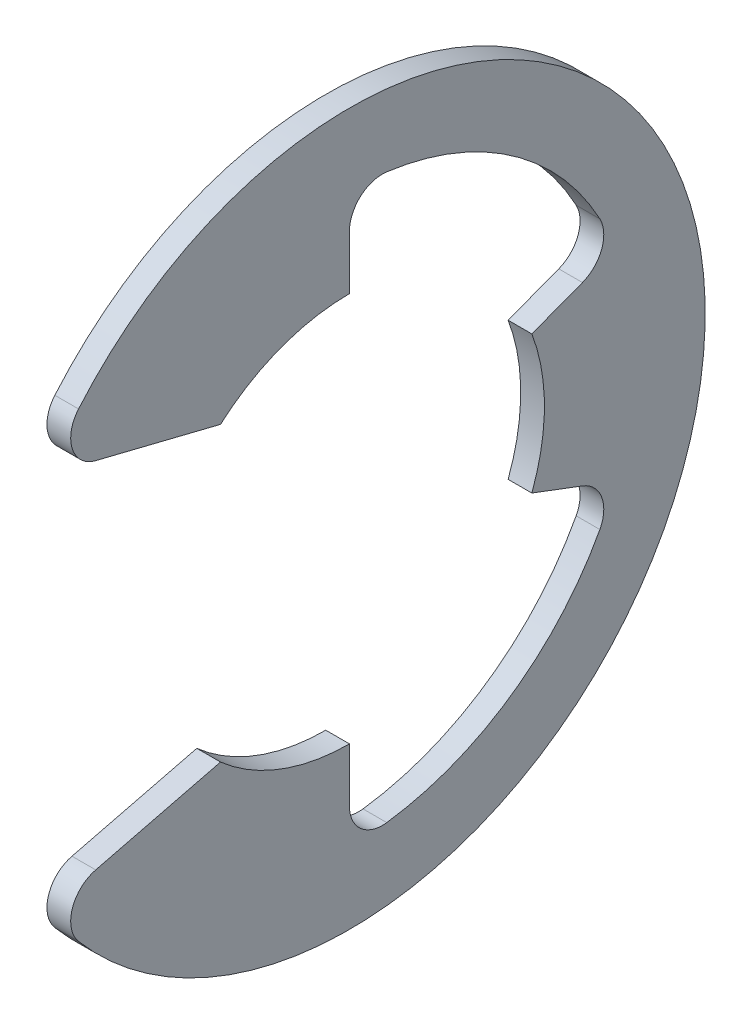
ISO-10303-21;
HEADER;
FILE_DESCRIPTION(('STEP AP214'),'2;1');
FILE_NAME('part.step','',(''),(''),'','','');
FILE_SCHEMA(('AUTOMOTIVE_DESIGN { 1 0 10303 214 1 1 1 1 }'));
ENDSEC;
DATA;
#1=APPLICATION_CONTEXT('core data for automotive mechanical design processes');
#2=APPLICATION_PROTOCOL_DEFINITION('international standard','automotive_design',2000,#1);
#3=PRODUCT_CONTEXT('',#1,'mechanical');
#4=PRODUCT('Part','Part','',(#3));
#5=PRODUCT_RELATED_PRODUCT_CATEGORY('part','',(#4));
#6=PRODUCT_DEFINITION_FORMATION('','',#4);
#7=PRODUCT_DEFINITION_CONTEXT('part definition',#1,'design');
#8=PRODUCT_DEFINITION('design','',#6,#7);
#9=PRODUCT_DEFINITION_SHAPE('','',#8);
#10=(LENGTH_UNIT() NAMED_UNIT(*) SI_UNIT(.MILLI.,.METRE.));
#11=(NAMED_UNIT(*) PLANE_ANGLE_UNIT() SI_UNIT($,.RADIAN.));
#12=(NAMED_UNIT(*) SI_UNIT($,.STERADIAN.) SOLID_ANGLE_UNIT());
#13=UNCERTAINTY_MEASURE_WITH_UNIT(LENGTH_MEASURE(1.E-05),#10,'distance_accuracy_value','');
#14=(GEOMETRIC_REPRESENTATION_CONTEXT(3) GLOBAL_UNCERTAINTY_ASSIGNED_CONTEXT((#13)) GLOBAL_UNIT_ASSIGNED_CONTEXT((#10,
#11,#12)) REPRESENTATION_CONTEXT('',''));
#15=CARTESIAN_POINT('',(0.,0.,0.));
#16=DIRECTION('',(0.,0.,1.));
#17=DIRECTION('',(1.,0.,0.));
#18=AXIS2_PLACEMENT_3D('',#15,#16,#17);
#19=CARTESIAN_POINT('',(-0.635,0.,0.));
#20=DIRECTION('',(-1.,0.,0.));
#21=DIRECTION('',(0.,0.,1.));
#22=AXIS2_PLACEMENT_3D('',#19,#20,#21);
#23=PLANE('',#22);
#24=DIRECTION('',(0.,1.,0.));
#25=VECTOR('',#24,1.);
#26=CARTESIAN_POINT('',(-0.635,10.4394,0.));
#27=LINE('',#26,#25);
#28=CARTESIAN_POINT('',(-0.635,10.4394,0.));
#29=VERTEX_POINT('',#28);
#30=CARTESIAN_POINT('',(-0.635,13.338729166687,0.));
#31=VERTEX_POINT('',#30);
#32=EDGE_CURVE('E175',#29,#31,#27,.T.);
#33=ORIENTED_EDGE('',*,*,#32,.F.);
#34=CARTESIAN_POINT('',(-0.635,0.,0.));
#35=DIRECTION('',(-1.,0.,0.));
#36=DIRECTION('',(0.,0.,1.));
#37=AXIS2_PLACEMENT_3D('',#34,#35,#36);
#38=CIRCLE('',#37,10.4394);
#39=CARTESIAN_POINT('',(-0.635,7.82955,6.90501405918192));
#40=VERTEX_POINT('',#39);
#41=EDGE_CURVE('E241',#29,#40,#38,.F.);
#42=ORIENTED_EDGE('',*,*,#41,.T.);
#43=DIRECTION('',(0.,-0.240952820606872,-0.970536829925373));
#44=VECTOR('',#43,1.);
#45=CARTESIAN_POINT('',(-0.635,10.1219114733049,16.1384450343451));
#46=LINE('',#45,#44);
#47=CARTESIAN_POINT('',(-0.635,9.48887934560397,13.5886471406645));
#48=VERTEX_POINT('',#47);
#49=EDGE_CURVE('E179',#48,#40,#46,.T.);
#50=ORIENTED_EDGE('',*,*,#49,.F.);
#51=CARTESIAN_POINT('',(-0.635,11.2021680114712,13.1632931264471));
#52=DIRECTION('',(-1.,0.,0.));
#53=DIRECTION('',(0.,0.,1.));
#54=AXIS2_PLACEMENT_3D('',#51,#52,#53);
#55=CIRCLE('',#54,1.7653);
#56=CARTESIAN_POINT('',(-0.635,12.3462542374775,14.5076706022562));
#57=VERTEX_POINT('',#56);
#58=EDGE_CURVE('E183',#57,#48,#55,.F.);
#59=ORIENTED_EDGE('',*,*,#58,.F.);
#60=CARTESIAN_POINT('',(-0.635,0.,0.));
#61=DIRECTION('',(-1.,0.,0.));
#62=DIRECTION('',(0.,0.,1.));
#63=AXIS2_PLACEMENT_3D('',#60,#61,#62);
#64=CIRCLE('',#63,19.05);
#65=CARTESIAN_POINT('',(-0.635,-12.3462542374775,14.5076706022562));
#66=VERTEX_POINT('',#65);
#67=EDGE_CURVE('E247',#66,#57,#64,.F.);
#68=ORIENTED_EDGE('',*,*,#67,.F.);
#69=CARTESIAN_POINT('',(-0.635,-11.2021680114712,13.1632931264471));
#70=DIRECTION('',(-1.,0.,0.));
#71=DIRECTION('',(0.,0.,1.));
#72=AXIS2_PLACEMENT_3D('',#69,#70,#71);
#73=CIRCLE('',#72,1.7653);
#74=CARTESIAN_POINT('',(-0.635,-9.48887934560397,13.5886471406645));
#75=VERTEX_POINT('',#74);
#76=EDGE_CURVE('E250',#75,#66,#73,.F.);
#77=ORIENTED_EDGE('',*,*,#76,.F.);
#78=DIRECTION('',(0.,-0.240952820606873,0.970536829925373));
#79=VECTOR('',#78,1.);
#80=CARTESIAN_POINT('',(-0.635,-10.1219114733049,16.1384450343451));
#81=LINE('',#80,#79);
#82=CARTESIAN_POINT('',(-0.635,-7.82955,6.90501405918192));
#83=VERTEX_POINT('',#82);
#84=EDGE_CURVE('E146',#83,#75,#81,.T.);
#85=ORIENTED_EDGE('',*,*,#84,.F.);
#86=CARTESIAN_POINT('',(-0.635,0.,0.));
#87=DIRECTION('',(-1.,0.,0.));
#88=DIRECTION('',(0.,0.,1.));
#89=AXIS2_PLACEMENT_3D('',#86,#87,#88);
#90=CIRCLE('',#89,10.4394);
#91=CARTESIAN_POINT('',(-0.635,-10.4394,0.));
#92=VERTEX_POINT('',#91);
#93=EDGE_CURVE('E20',#83,#92,#90,.F.);
#94=ORIENTED_EDGE('',*,*,#93,.T.);
#95=DIRECTION('',(0.,1.,0.));
#96=VECTOR('',#95,1.);
#97=CARTESIAN_POINT('',(-0.635,-10.4394,0.));
#98=LINE('',#97,#96);
#99=CARTESIAN_POINT('',(-0.635,-13.338729166687,0.));
#100=VERTEX_POINT('',#99);
#101=EDGE_CURVE('E143',#100,#92,#98,.T.);
#102=ORIENTED_EDGE('',*,*,#101,.F.);
#103=CARTESIAN_POINT('',(-0.635,-13.338729166687,-1.7653));
#104=DIRECTION('',(-1.,0.,0.));
#105=DIRECTION('',(0.,0.,1.));
#106=AXIS2_PLACEMENT_3D('',#103,#104,#105);
#107=CIRCLE('',#106,1.7653);
#108=CARTESIAN_POINT('',(-0.635,-15.0887697835385,-1.99690727400055));
#109=VERTEX_POINT('',#108);
#110=EDGE_CURVE('E220',#100,#109,#107,.F.);
#111=ORIENTED_EDGE('',*,*,#110,.T.);
#112=CARTESIAN_POINT('',(-0.635,0.,0.));
#113=DIRECTION('',(-1.,0.,0.));
#114=DIRECTION('',(0.,0.,1.));
#115=AXIS2_PLACEMENT_3D('',#112,#113,#114);
#116=CIRCLE('',#115,15.220335483871);
#117=CARTESIAN_POINT('',(-0.635,-7.20262142996807,-13.4082383920538));
#118=VERTEX_POINT('',#117);
#119=EDGE_CURVE('E222',#109,#118,#116,.F.);
#120=ORIENTED_EDGE('',*,*,#119,.T.);
#121=CARTESIAN_POINT('',(-0.635,-6.3672398693056,-11.8531108287636));
#122=DIRECTION('',(-1.,0.,0.));
#123=DIRECTION('',(0.,0.,1.));
#124=AXIS2_PLACEMENT_3D('',#121,#122,#123);
#125=CIRCLE('',#124,1.7653);
#126=CARTESIAN_POINT('',(-0.635,-4.71595292308758,-12.4772386291779));
#127=VERTEX_POINT('',#126);
#128=EDGE_CURVE('E225',#118,#127,#125,.F.);
#129=ORIENTED_EDGE('',*,*,#128,.T.);
#130=DIRECTION('',(0.,-0.353553390593274,-0.935414346693485));
#131=VECTOR('',#130,1.);
#132=CARTESIAN_POINT('',(-0.635,-3.69088526575942,-9.76516453087197));
#133=LINE('',#132,#131);
#134=CARTESIAN_POINT('',(-0.635,-3.69088526575942,-9.76516453087197));
#135=VERTEX_POINT('',#134);
#136=EDGE_CURVE('E166',#135,#127,#133,.T.);
#137=ORIENTED_EDGE('',*,*,#136,.F.);
#138=CARTESIAN_POINT('',(-0.635,0.,0.));
#139=DIRECTION('',(-1.,0.,0.));
#140=DIRECTION('',(0.,0.,1.));
#141=AXIS2_PLACEMENT_3D('',#138,#139,#140);
#142=CIRCLE('',#141,10.4394);
#143=CARTESIAN_POINT('',(-0.635,3.69088526575942,-9.76516453087196));
#144=VERTEX_POINT('',#143);
#145=EDGE_CURVE('E228',#135,#144,#142,.F.);
#146=ORIENTED_EDGE('',*,*,#145,.T.);
#147=DIRECTION('',(0.,-0.353553390593274,0.935414346693485));
#148=VECTOR('',#147,1.);
#149=CARTESIAN_POINT('',(-0.635,3.69088526575942,-9.76516453087197));
#150=LINE('',#149,#148);
#151=CARTESIAN_POINT('',(-0.635,4.71595292308759,-12.4772386291779));
#152=VERTEX_POINT('',#151);
#153=EDGE_CURVE('E170',#152,#144,#150,.T.);
#154=ORIENTED_EDGE('',*,*,#153,.F.);
#155=CARTESIAN_POINT('',(-0.635,6.3672398693056,-11.8531108287636));
#156=DIRECTION('',(-1.,0.,0.));
#157=DIRECTION('',(0.,0.,1.));
#158=AXIS2_PLACEMENT_3D('',#155,#156,#157);
#159=CIRCLE('',#158,1.7653);
#160=CARTESIAN_POINT('',(-0.635,7.20262142996808,-13.4082383920538));
#161=VERTEX_POINT('',#160);
#162=EDGE_CURVE('E174',#152,#161,#159,.F.);
#163=ORIENTED_EDGE('',*,*,#162,.T.);
#164=CARTESIAN_POINT('',(-0.635,0.,0.));
#165=DIRECTION('',(-1.,0.,0.));
#166=DIRECTION('',(0.,0.,1.));
#167=AXIS2_PLACEMENT_3D('',#164,#165,#166);
#168=CIRCLE('',#167,15.220335483871);
#169=CARTESIAN_POINT('',(-0.635,15.0887697835385,-1.99690727400054));
#170=VERTEX_POINT('',#169);
#171=EDGE_CURVE('E234',#161,#170,#168,.F.);
#172=ORIENTED_EDGE('',*,*,#171,.T.);
#173=CARTESIAN_POINT('',(-0.635,13.338729166687,-1.7653));
#174=DIRECTION('',(-1.,0.,0.));
#175=DIRECTION('',(0.,0.,1.));
#176=AXIS2_PLACEMENT_3D('',#173,#174,#175);
#177=CIRCLE('',#176,1.7653);
#178=EDGE_CURVE('E238',#170,#31,#177,.F.);
#179=ORIENTED_EDGE('',*,*,#178,.T.);
#180=EDGE_LOOP('',(#33,#42,#50,#59,#68,#77,#85,#94,#102,#111,#120,#129,#137,#146,#154,#163,#172,#179));
#181=FACE_BOUND('',#180,.T.);
#182=ADVANCED_FACE('F17',(#181),#23,.T.);
#183=CARTESIAN_POINT('',(0.635,-10.4394,0.));
#184=DIRECTION('',(0.,0.,-1.));
#185=DIRECTION('',(-1.,0.,0.));
#186=AXIS2_PLACEMENT_3D('',#183,#184,#185);
#187=PLANE('',#186);
#188=DIRECTION('',(0.,1.,0.));
#189=VECTOR('',#188,1.);
#190=CARTESIAN_POINT('',(0.635,0.,0.));
#191=LINE('',#190,#189);
#192=CARTESIAN_POINT('',(0.635,-13.338729166687,0.));
#193=VERTEX_POINT('',#192);
#194=CARTESIAN_POINT('',(0.635,-10.4394,0.));
#195=VERTEX_POINT('',#194);
#196=EDGE_CURVE('E219',#193,#195,#191,.T.);
#197=ORIENTED_EDGE('',*,*,#196,.F.);
#198=DIRECTION('',(-1.,0.,0.));
#199=VECTOR('',#198,1.);
#200=CARTESIAN_POINT('',(0.635,-13.338729166687,0.));
#201=LINE('',#200,#199);
#202=EDGE_CURVE('E154',#193,#100,#201,.T.);
#203=ORIENTED_EDGE('',*,*,#202,.T.);
#204=ORIENTED_EDGE('',*,*,#101,.T.);
#205=DIRECTION('',(-1.,0.,0.));
#206=VECTOR('',#205,1.);
#207=CARTESIAN_POINT('',(0.635,-10.4394,0.));
#208=LINE('',#207,#206);
#209=EDGE_CURVE('E148',#92,#195,#208,.F.);
#210=ORIENTED_EDGE('',*,*,#209,.T.);
#211=EDGE_LOOP('',(#197,#203,#204,#210));
#212=FACE_BOUND('',#211,.T.);
#213=ADVANCED_FACE('F151',(#212),#187,.T.);
#214=CARTESIAN_POINT('',(0.635,0.,0.));
#215=DIRECTION('',(-1.,0.,0.));
#216=DIRECTION('',(0.,0.,1.));
#217=AXIS2_PLACEMENT_3D('',#214,#215,#216);
#218=CYLINDRICAL_SURFACE('',#217,10.4394);
#219=ORIENTED_EDGE('',*,*,#209,.F.);
#220=ORIENTED_EDGE('',*,*,#93,.F.);
#221=DIRECTION('',(1.,0.,0.));
#222=VECTOR('',#221,1.);
#223=CARTESIAN_POINT('',(0.635,-7.82955,6.90501405918192));
#224=LINE('',#223,#222);
#225=CARTESIAN_POINT('',(0.635,-7.82955,6.90501405918191));
#226=VERTEX_POINT('',#225);
#227=EDGE_CURVE('E161',#226,#83,#224,.F.);
#228=ORIENTED_EDGE('',*,*,#227,.F.);
#229=CARTESIAN_POINT('',(0.635,0.,0.));
#230=DIRECTION('',(-1.,0.,0.));
#231=DIRECTION('',(0.,0.,1.));
#232=AXIS2_PLACEMENT_3D('',#229,#230,#231);
#233=CIRCLE('',#232,10.4394);
#234=EDGE_CURVE('E159',#195,#226,#233,.T.);
#235=ORIENTED_EDGE('',*,*,#234,.F.);
#236=EDGE_LOOP('',(#219,#220,#228,#235));
#237=FACE_BOUND('',#236,.T.);
#238=ADVANCED_FACE('F157',(#237),#218,.F.);
#239=CARTESIAN_POINT('',(0.635,-10.1219114733049,16.1384450343451));
#240=DIRECTION('',(0.,0.970536829925373,0.240952820606873));
#241=DIRECTION('',(0.,-0.240952820606873,0.970536829925373));
#242=AXIS2_PLACEMENT_3D('',#239,#240,#241);
#243=PLANE('',#242);
#244=ORIENTED_EDGE('',*,*,#84,.T.);
#245=DIRECTION('',(-1.,0.,0.));
#246=VECTOR('',#245,1.);
#247=CARTESIAN_POINT('',(0.635,-9.48887934560397,13.5886471406645));
#248=LINE('',#247,#246);
#249=CARTESIAN_POINT('',(0.635,-9.48887934560397,13.5886471406645));
#250=VERTEX_POINT('',#249);
#251=EDGE_CURVE('E184',#250,#75,#248,.T.);
#252=ORIENTED_EDGE('',*,*,#251,.F.);
#253=DIRECTION('',(0.,-0.240952820606872,0.970536829925373));
#254=VECTOR('',#253,1.);
#255=CARTESIAN_POINT('',(0.635,-7.82955,6.90501405918191));
#256=LINE('',#255,#254);
#257=EDGE_CURVE('E217',#226,#250,#256,.T.);
#258=ORIENTED_EDGE('',*,*,#257,.F.);
#259=ORIENTED_EDGE('',*,*,#227,.T.);
#260=EDGE_LOOP('',(#244,#252,#258,#259));
#261=FACE_BOUND('',#260,.T.);
#262=ADVANCED_FACE('F343',(#261),#243,.T.);
#263=CARTESIAN_POINT('',(0.635,-11.2021680114712,13.1632931264471));
#264=DIRECTION('',(-1.,0.,0.));
#265=DIRECTION('',(0.,0.,1.));
#266=AXIS2_PLACEMENT_3D('',#263,#264,#265);
#267=CYLINDRICAL_SURFACE('',#266,1.7653);
#268=ORIENTED_EDGE('',*,*,#76,.T.);
#269=DIRECTION('',(-1.,0.,0.));
#270=VECTOR('',#269,1.);
#271=CARTESIAN_POINT('',(0.635,-12.3462542374775,14.5076706022562));
#272=LINE('',#271,#270);
#273=CARTESIAN_POINT('',(0.635,-12.3462542374775,14.5076706022562));
#274=VERTEX_POINT('',#273);
#275=EDGE_CURVE('E249',#274,#66,#272,.T.);
#276=ORIENTED_EDGE('',*,*,#275,.F.);
#277=CARTESIAN_POINT('',(0.635,-11.2021680114712,13.1632931264471));
#278=DIRECTION('',(-1.,0.,0.));
#279=DIRECTION('',(0.,0.,1.));
#280=AXIS2_PLACEMENT_3D('',#277,#278,#279);
#281=CIRCLE('',#280,1.7653);
#282=EDGE_CURVE('E215',#250,#274,#281,.F.);
#283=ORIENTED_EDGE('',*,*,#282,.F.);
#284=ORIENTED_EDGE('',*,*,#251,.T.);
#285=EDGE_LOOP('',(#268,#276,#283,#284));
#286=FACE_BOUND('',#285,.T.);
#287=ADVANCED_FACE('F340',(#286),#267,.T.);
#288=CARTESIAN_POINT('',(0.635,0.,0.));
#289=DIRECTION('',(-1.,0.,0.));
#290=DIRECTION('',(0.,0.,1.));
#291=AXIS2_PLACEMENT_3D('',#288,#289,#290);
#292=CYLINDRICAL_SURFACE('',#291,19.05);
#293=CARTESIAN_POINT('',(0.635,0.,0.));
#294=DIRECTION('',(-1.,0.,0.));
#295=DIRECTION('',(0.,0.,1.));
#296=AXIS2_PLACEMENT_3D('',#293,#294,#295);
#297=CIRCLE('',#296,19.05);
#298=CARTESIAN_POINT('',(0.635,12.3462542374775,14.5076706022562));
#299=VERTEX_POINT('',#298);
#300=EDGE_CURVE('E212',#274,#299,#297,.F.);
#301=ORIENTED_EDGE('',*,*,#300,.F.);
#302=ORIENTED_EDGE('',*,*,#275,.T.);
#303=ORIENTED_EDGE('',*,*,#67,.T.);
#304=DIRECTION('',(-1.,0.,0.));
#305=VECTOR('',#304,1.);
#306=CARTESIAN_POINT('',(0.635,12.3462542374775,14.5076706022562));
#307=LINE('',#306,#305);
#308=EDGE_CURVE('E246',#299,#57,#307,.T.);
#309=ORIENTED_EDGE('',*,*,#308,.F.);
#310=EDGE_LOOP('',(#301,#302,#303,#309));
#311=FACE_BOUND('',#310,.T.);
#312=ADVANCED_FACE('F339',(#311),#292,.T.);
#313=CARTESIAN_POINT('',(0.635,11.2021680114712,13.1632931264471));
#314=DIRECTION('',(-1.,0.,0.));
#315=DIRECTION('',(0.,0.,1.));
#316=AXIS2_PLACEMENT_3D('',#313,#314,#315);
#317=CYLINDRICAL_SURFACE('',#316,1.7653);
#318=ORIENTED_EDGE('',*,*,#58,.T.);
#319=DIRECTION('',(1.,0.,0.));
#320=VECTOR('',#319,1.);
#321=CARTESIAN_POINT('',(0.635,9.48887934560397,13.5886471406645));
#322=LINE('',#321,#320);
#323=CARTESIAN_POINT('',(0.635,9.48887934560397,13.5886471406645));
#324=VERTEX_POINT('',#323);
#325=EDGE_CURVE('E182',#324,#48,#322,.F.);
#326=ORIENTED_EDGE('',*,*,#325,.F.);
#327=CARTESIAN_POINT('',(0.635,11.2021680114712,13.1632931264471));
#328=DIRECTION('',(-1.,0.,0.));
#329=DIRECTION('',(0.,0.,1.));
#330=AXIS2_PLACEMENT_3D('',#327,#328,#329);
#331=CIRCLE('',#330,1.7653);
#332=EDGE_CURVE('E210',#299,#324,#331,.F.);
#333=ORIENTED_EDGE('',*,*,#332,.F.);
#334=ORIENTED_EDGE('',*,*,#308,.T.);
#335=EDGE_LOOP('',(#318,#326,#333,#334));
#336=FACE_BOUND('',#335,.T.);
#337=ADVANCED_FACE('F337',(#336),#317,.T.);
#338=CARTESIAN_POINT('',(0.635,10.1219114733049,16.1384450343451));
#339=DIRECTION('',(0.,-0.970536829925373,0.240952820606872));
#340=DIRECTION('',(0.,-0.240952820606872,-0.970536829925373));
#341=AXIS2_PLACEMENT_3D('',#338,#339,#340);
#342=PLANE('',#341);
#343=DIRECTION('',(0.,-0.240952820606872,-0.970536829925373));
#344=VECTOR('',#343,1.);
#345=CARTESIAN_POINT('',(0.635,9.48887934560397,13.5886471406645));
#346=LINE('',#345,#344);
#347=CARTESIAN_POINT('',(0.635,7.82955,6.90501405918192));
#348=VERTEX_POINT('',#347);
#349=EDGE_CURVE('E209',#324,#348,#346,.T.);
#350=ORIENTED_EDGE('',*,*,#349,.F.);
#351=ORIENTED_EDGE('',*,*,#325,.T.);
#352=ORIENTED_EDGE('',*,*,#49,.T.);
#353=DIRECTION('',(-1.,0.,0.));
#354=VECTOR('',#353,1.);
#355=CARTESIAN_POINT('',(0.635,7.82955,6.90501405918192));
#356=LINE('',#355,#354);
#357=EDGE_CURVE('E243',#40,#348,#356,.F.);
#358=ORIENTED_EDGE('',*,*,#357,.T.);
#359=EDGE_LOOP('',(#350,#351,#352,#358));
#360=FACE_BOUND('',#359,.T.);
#361=ADVANCED_FACE('F330',(#360),#342,.T.);
#362=CARTESIAN_POINT('',(0.635,0.,0.));
#363=DIRECTION('',(-1.,0.,0.));
#364=DIRECTION('',(0.,0.,1.));
#365=AXIS2_PLACEMENT_3D('',#362,#363,#364);
#366=CYLINDRICAL_SURFACE('',#365,10.4394);
#367=ORIENTED_EDGE('',*,*,#357,.F.);
#368=ORIENTED_EDGE('',*,*,#41,.F.);
#369=DIRECTION('',(-1.,0.,0.));
#370=VECTOR('',#369,1.);
#371=CARTESIAN_POINT('',(0.635,10.4394,0.));
#372=LINE('',#371,#370);
#373=CARTESIAN_POINT('',(0.635,10.4394,0.));
#374=VERTEX_POINT('',#373);
#375=EDGE_CURVE('E178',#374,#29,#372,.T.);
#376=ORIENTED_EDGE('',*,*,#375,.F.);
#377=CARTESIAN_POINT('',(0.635,0.,0.));
#378=DIRECTION('',(-1.,0.,0.));
#379=DIRECTION('',(0.,0.,1.));
#380=AXIS2_PLACEMENT_3D('',#377,#378,#379);
#381=CIRCLE('',#380,10.4394);
#382=EDGE_CURVE('E206',#348,#374,#381,.T.);
#383=ORIENTED_EDGE('',*,*,#382,.F.);
#384=EDGE_LOOP('',(#367,#368,#376,#383));
#385=FACE_BOUND('',#384,.T.);
#386=ADVANCED_FACE('F333',(#385),#366,.F.);
#387=CARTESIAN_POINT('',(0.635,10.4394,0.));
#388=DIRECTION('',(0.,0.,-1.));
#389=DIRECTION('',(-1.,0.,0.));
#390=AXIS2_PLACEMENT_3D('',#387,#388,#389);
#391=PLANE('',#390);
#392=ORIENTED_EDGE('',*,*,#32,.T.);
#393=DIRECTION('',(-1.,0.,0.));
#394=VECTOR('',#393,1.);
#395=CARTESIAN_POINT('',(0.635,13.338729166687,0.));
#396=LINE('',#395,#394);
#397=CARTESIAN_POINT('',(0.635,13.338729166687,0.));
#398=VERTEX_POINT('',#397);
#399=EDGE_CURVE('E177',#31,#398,#396,.F.);
#400=ORIENTED_EDGE('',*,*,#399,.T.);
#401=DIRECTION('',(0.,1.,0.));
#402=VECTOR('',#401,1.);
#403=CARTESIAN_POINT('',(0.635,0.,0.));
#404=LINE('',#403,#402);
#405=EDGE_CURVE('E205',#374,#398,#404,.T.);
#406=ORIENTED_EDGE('',*,*,#405,.F.);
#407=ORIENTED_EDGE('',*,*,#375,.T.);
#408=EDGE_LOOP('',(#392,#400,#406,#407));
#409=FACE_BOUND('',#408,.T.);
#410=ADVANCED_FACE('F325',(#409),#391,.T.);
#411=CARTESIAN_POINT('',(0.635,13.338729166687,-1.7653));
#412=DIRECTION('',(-1.,0.,0.));
#413=DIRECTION('',(0.,0.,1.));
#414=AXIS2_PLACEMENT_3D('',#411,#412,#413);
#415=CYLINDRICAL_SURFACE('',#414,1.7653);
#416=DIRECTION('',(-1.,0.,0.));
#417=VECTOR('',#416,1.);
#418=CARTESIAN_POINT('',(0.635,15.0887697835385,-1.99690727400054));
#419=LINE('',#418,#417);
#420=CARTESIAN_POINT('',(0.635,15.0887697835385,-1.99690727400054));
#421=VERTEX_POINT('',#420);
#422=EDGE_CURVE('E237',#170,#421,#419,.F.);
#423=ORIENTED_EDGE('',*,*,#422,.T.);
#424=CARTESIAN_POINT('',(0.635,13.338729166687,-1.7653));
#425=DIRECTION('',(-1.,0.,0.));
#426=DIRECTION('',(0.,0.,1.));
#427=AXIS2_PLACEMENT_3D('',#424,#425,#426);
#428=CIRCLE('',#427,1.7653);
#429=EDGE_CURVE('E202',#398,#421,#428,.T.);
#430=ORIENTED_EDGE('',*,*,#429,.F.);
#431=ORIENTED_EDGE('',*,*,#399,.F.);
#432=ORIENTED_EDGE('',*,*,#178,.F.);
#433=EDGE_LOOP('',(#423,#430,#431,#432));
#434=FACE_BOUND('',#433,.T.);
#435=ADVANCED_FACE('F322',(#434),#415,.F.);
#436=CARTESIAN_POINT('',(0.635,0.,0.));
#437=DIRECTION('',(-1.,0.,0.));
#438=DIRECTION('',(0.,0.,1.));
#439=AXIS2_PLACEMENT_3D('',#436,#437,#438);
#440=CYLINDRICAL_SURFACE('',#439,15.220335483871);
#441=DIRECTION('',(-1.,0.,0.));
#442=VECTOR('',#441,1.);
#443=CARTESIAN_POINT('',(0.635,7.20262142996808,-13.4082383920538));
#444=LINE('',#443,#442);
#445=CARTESIAN_POINT('',(0.635,7.20262142996808,-13.4082383920538));
#446=VERTEX_POINT('',#445);
#447=EDGE_CURVE('E233',#161,#446,#444,.F.);
#448=ORIENTED_EDGE('',*,*,#447,.T.);
#449=CARTESIAN_POINT('',(0.635,0.,0.));
#450=DIRECTION('',(-1.,0.,0.));
#451=DIRECTION('',(0.,0.,1.));
#452=AXIS2_PLACEMENT_3D('',#449,#450,#451);
#453=CIRCLE('',#452,15.220335483871);
#454=EDGE_CURVE('E199',#421,#446,#453,.T.);
#455=ORIENTED_EDGE('',*,*,#454,.F.);
#456=ORIENTED_EDGE('',*,*,#422,.F.);
#457=ORIENTED_EDGE('',*,*,#171,.F.);
#458=EDGE_LOOP('',(#448,#455,#456,#457));
#459=FACE_BOUND('',#458,.T.);
#460=ADVANCED_FACE('F319',(#459),#440,.F.);
#461=CARTESIAN_POINT('',(0.635,6.3672398693056,-11.8531108287636));
#462=DIRECTION('',(-1.,0.,0.));
#463=DIRECTION('',(0.,0.,1.));
#464=AXIS2_PLACEMENT_3D('',#461,#462,#463);
#465=CYLINDRICAL_SURFACE('',#464,1.7653);
#466=DIRECTION('',(1.,0.,0.));
#467=VECTOR('',#466,1.);
#468=CARTESIAN_POINT('',(0.635,4.71595292308759,-12.4772386291779));
#469=LINE('',#468,#467);
#470=CARTESIAN_POINT('',(0.635,4.71595292308759,-12.4772386291779));
#471=VERTEX_POINT('',#470);
#472=EDGE_CURVE('E173',#471,#152,#469,.F.);
#473=ORIENTED_EDGE('',*,*,#472,.F.);
#474=CARTESIAN_POINT('',(0.635,6.3672398693056,-11.8531108287636));
#475=DIRECTION('',(-1.,0.,0.));
#476=DIRECTION('',(0.,0.,1.));
#477=AXIS2_PLACEMENT_3D('',#474,#475,#476);
#478=CIRCLE('',#477,1.7653);
#479=EDGE_CURVE('E196',#446,#471,#478,.T.);
#480=ORIENTED_EDGE('',*,*,#479,.F.);
#481=ORIENTED_EDGE('',*,*,#447,.F.);
#482=ORIENTED_EDGE('',*,*,#162,.F.);
#483=EDGE_LOOP('',(#473,#480,#481,#482));
#484=FACE_BOUND('',#483,.T.);
#485=ADVANCED_FACE('F315',(#484),#465,.F.);
#486=CARTESIAN_POINT('',(0.635,3.69088526575942,-9.76516453087197));
#487=DIRECTION('',(0.,0.935414346693485,0.353553390593274));
#488=DIRECTION('',(0.,-0.353553390593274,0.935414346693485));
#489=AXIS2_PLACEMENT_3D('',#486,#487,#488);
#490=PLANE('',#489);
#491=DIRECTION('',(0.,-0.353553390593274,0.935414346693485));
#492=VECTOR('',#491,1.);
#493=CARTESIAN_POINT('',(0.635,4.71595292308759,-12.4772386291779));
#494=LINE('',#493,#492);
#495=CARTESIAN_POINT('',(0.635,3.69088526575942,-9.76516453087196));
#496=VERTEX_POINT('',#495);
#497=EDGE_CURVE('E195',#471,#496,#494,.T.);
#498=ORIENTED_EDGE('',*,*,#497,.F.);
#499=ORIENTED_EDGE('',*,*,#472,.T.);
#500=ORIENTED_EDGE('',*,*,#153,.T.);
#501=DIRECTION('',(-1.,0.,0.));
#502=VECTOR('',#501,1.);
#503=CARTESIAN_POINT('',(0.635,3.69088526575942,-9.76516453087196));
#504=LINE('',#503,#502);
#505=EDGE_CURVE('E230',#144,#496,#504,.F.);
#506=ORIENTED_EDGE('',*,*,#505,.T.);
#507=EDGE_LOOP('',(#498,#499,#500,#506));
#508=FACE_BOUND('',#507,.T.);
#509=ADVANCED_FACE('F309',(#508),#490,.T.);
#510=CARTESIAN_POINT('',(0.635,0.,0.));
#511=DIRECTION('',(-1.,0.,0.));
#512=DIRECTION('',(0.,0.,1.));
#513=AXIS2_PLACEMENT_3D('',#510,#511,#512);
#514=CYLINDRICAL_SURFACE('',#513,10.4394);
#515=ORIENTED_EDGE('',*,*,#505,.F.);
#516=ORIENTED_EDGE('',*,*,#145,.F.);
#517=DIRECTION('',(1.,0.,0.));
#518=VECTOR('',#517,1.);
#519=CARTESIAN_POINT('',(0.635,-3.69088526575942,-9.76516453087197));
#520=LINE('',#519,#518);
#521=CARTESIAN_POINT('',(0.635,-3.69088526575942,-9.76516453087197));
#522=VERTEX_POINT('',#521);
#523=EDGE_CURVE('E169',#522,#135,#520,.F.);
#524=ORIENTED_EDGE('',*,*,#523,.F.);
#525=CARTESIAN_POINT('',(0.635,0.,0.));
#526=DIRECTION('',(-1.,0.,0.));
#527=DIRECTION('',(0.,0.,1.));
#528=AXIS2_PLACEMENT_3D('',#525,#526,#527);
#529=CIRCLE('',#528,10.4394);
#530=EDGE_CURVE('E192',#496,#522,#529,.T.);
#531=ORIENTED_EDGE('',*,*,#530,.F.);
#532=EDGE_LOOP('',(#515,#516,#524,#531));
#533=FACE_BOUND('',#532,.T.);
#534=ADVANCED_FACE('F310',(#533),#514,.F.);
#535=CARTESIAN_POINT('',(0.635,-3.69088526575942,-9.76516453087197));
#536=DIRECTION('',(0.,-0.935414346693485,0.353553390593274));
#537=DIRECTION('',(0.,-0.353553390593274,-0.935414346693485));
#538=AXIS2_PLACEMENT_3D('',#535,#536,#537);
#539=PLANE('',#538);
#540=ORIENTED_EDGE('',*,*,#136,.T.);
#541=DIRECTION('',(-1.,0.,0.));
#542=VECTOR('',#541,1.);
#543=CARTESIAN_POINT('',(0.635,-4.71595292308758,-12.4772386291779));
#544=LINE('',#543,#542);
#545=CARTESIAN_POINT('',(0.635,-4.71595292308758,-12.4772386291779));
#546=VERTEX_POINT('',#545);
#547=EDGE_CURVE('E168',#127,#546,#544,.F.);
#548=ORIENTED_EDGE('',*,*,#547,.T.);
#549=DIRECTION('',(0.,-0.353553390593273,-0.935414346693485));
#550=VECTOR('',#549,1.);
#551=CARTESIAN_POINT('',(0.635,-3.69088526575942,-9.76516453087197));
#552=LINE('',#551,#550);
#553=EDGE_CURVE('E191',#522,#546,#552,.T.);
#554=ORIENTED_EDGE('',*,*,#553,.F.);
#555=ORIENTED_EDGE('',*,*,#523,.T.);
#556=EDGE_LOOP('',(#540,#548,#554,#555));
#557=FACE_BOUND('',#556,.T.);
#558=ADVANCED_FACE('F294',(#557),#539,.T.);
#559=CARTESIAN_POINT('',(0.635,-6.3672398693056,-11.8531108287636));
#560=DIRECTION('',(-1.,0.,0.));
#561=DIRECTION('',(0.,0.,1.));
#562=AXIS2_PLACEMENT_3D('',#559,#560,#561);
#563=CYLINDRICAL_SURFACE('',#562,1.7653);
#564=DIRECTION('',(-1.,0.,0.));
#565=VECTOR('',#564,1.);
#566=CARTESIAN_POINT('',(0.635,-7.20262142996807,-13.4082383920538));
#567=LINE('',#566,#565);
#568=CARTESIAN_POINT('',(0.635,-7.20262142996807,-13.4082383920538));
#569=VERTEX_POINT('',#568);
#570=EDGE_CURVE('E224',#118,#569,#567,.F.);
#571=ORIENTED_EDGE('',*,*,#570,.T.);
#572=CARTESIAN_POINT('',(0.635,-6.3672398693056,-11.8531108287636));
#573=DIRECTION('',(-1.,0.,0.));
#574=DIRECTION('',(0.,0.,1.));
#575=AXIS2_PLACEMENT_3D('',#572,#573,#574);
#576=CIRCLE('',#575,1.7653);
#577=EDGE_CURVE('E188',#546,#569,#576,.T.);
#578=ORIENTED_EDGE('',*,*,#577,.F.);
#579=ORIENTED_EDGE('',*,*,#547,.F.);
#580=ORIENTED_EDGE('',*,*,#128,.F.);
#581=EDGE_LOOP('',(#571,#578,#579,#580));
#582=FACE_BOUND('',#581,.T.);
#583=ADVANCED_FACE('F299',(#582),#563,.F.);
#584=CARTESIAN_POINT('',(0.635,0.,0.));
#585=DIRECTION('',(-1.,0.,0.));
#586=DIRECTION('',(0.,0.,1.));
#587=AXIS2_PLACEMENT_3D('',#584,#585,#586);
#588=CYLINDRICAL_SURFACE('',#587,15.220335483871);
#589=ORIENTED_EDGE('',*,*,#570,.F.);
#590=ORIENTED_EDGE('',*,*,#119,.F.);
#591=DIRECTION('',(-1.,0.,0.));
#592=VECTOR('',#591,1.);
#593=CARTESIAN_POINT('',(0.635,-15.0887697835385,-1.99690727400055));
#594=LINE('',#593,#592);
#595=CARTESIAN_POINT('',(0.635,-15.0887697835385,-1.99690727400055));
#596=VERTEX_POINT('',#595);
#597=EDGE_CURVE('E35',#109,#596,#594,.F.);
#598=ORIENTED_EDGE('',*,*,#597,.T.);
#599=CARTESIAN_POINT('',(0.635,0.,0.));
#600=DIRECTION('',(-1.,0.,0.));
#601=DIRECTION('',(0.,0.,1.));
#602=AXIS2_PLACEMENT_3D('',#599,#600,#601);
#603=CIRCLE('',#602,15.220335483871);
#604=EDGE_CURVE('E26',#569,#596,#603,.T.);
#605=ORIENTED_EDGE('',*,*,#604,.F.);
#606=EDGE_LOOP('',(#589,#590,#598,#605));
#607=FACE_BOUND('',#606,.T.);
#608=ADVANCED_FACE('F301',(#607),#588,.F.);
#609=CARTESIAN_POINT('',(0.635,-13.338729166687,-1.7653));
#610=DIRECTION('',(-1.,0.,0.));
#611=DIRECTION('',(0.,0.,1.));
#612=AXIS2_PLACEMENT_3D('',#609,#610,#611);
#613=CYLINDRICAL_SURFACE('',#612,1.7653);
#614=ORIENTED_EDGE('',*,*,#202,.F.);
#615=CARTESIAN_POINT('',(0.635,-13.338729166687,-1.7653));
#616=DIRECTION('',(-1.,0.,0.));
#617=DIRECTION('',(0.,0.,1.));
#618=AXIS2_PLACEMENT_3D('',#615,#616,#617);
#619=CIRCLE('',#618,1.7653);
#620=EDGE_CURVE('E11',#596,#193,#619,.T.);
#621=ORIENTED_EDGE('',*,*,#620,.F.);
#622=ORIENTED_EDGE('',*,*,#597,.F.);
#623=ORIENTED_EDGE('',*,*,#110,.F.);
#624=EDGE_LOOP('',(#614,#621,#622,#623));
#625=FACE_BOUND('',#624,.T.);
#626=ADVANCED_FACE('F303',(#625),#613,.F.);
#627=CARTESIAN_POINT('',(0.635,0.,0.));
#628=DIRECTION('',(1.,0.,0.));
#629=DIRECTION('',(0.,0.,-1.));
#630=AXIS2_PLACEMENT_3D('',#627,#628,#629);
#631=PLANE('',#630);
#632=ORIENTED_EDGE('',*,*,#604,.T.);
#633=ORIENTED_EDGE('',*,*,#620,.T.);
#634=ORIENTED_EDGE('',*,*,#196,.T.);
#635=ORIENTED_EDGE('',*,*,#234,.T.);
#636=ORIENTED_EDGE('',*,*,#257,.T.);
#637=ORIENTED_EDGE('',*,*,#282,.T.);
#638=ORIENTED_EDGE('',*,*,#300,.T.);
#639=ORIENTED_EDGE('',*,*,#332,.T.);
#640=ORIENTED_EDGE('',*,*,#349,.T.);
#641=ORIENTED_EDGE('',*,*,#382,.T.);
#642=ORIENTED_EDGE('',*,*,#405,.T.);
#643=ORIENTED_EDGE('',*,*,#429,.T.);
#644=ORIENTED_EDGE('',*,*,#454,.T.);
#645=ORIENTED_EDGE('',*,*,#479,.T.);
#646=ORIENTED_EDGE('',*,*,#497,.T.);
#647=ORIENTED_EDGE('',*,*,#530,.T.);
#648=ORIENTED_EDGE('',*,*,#553,.T.);
#649=ORIENTED_EDGE('',*,*,#577,.T.);
#650=EDGE_LOOP('',(#632,#633,#634,#635,#636,#637,#638,#639,#640,#641,#642,#643,#644,#645,#646,
#647,#648,#649));
#651=FACE_BOUND('',#650,.T.);
#652=ADVANCED_FACE('F290',(#651),#631,.T.);
#653=CLOSED_SHELL('',(#182,#213,#238,#262,#287,#312,#337,#361,#386,#410,#435,#460,#485,#509,
#534,#558,#583,#608,#626,#652));
#654=MANIFOLD_SOLID_BREP('B1',#653);
#655=ADVANCED_BREP_SHAPE_REPRESENTATION('',(#18,#654),#14);
#656=SHAPE_DEFINITION_REPRESENTATION(#9,#655);
ENDSEC;
END-ISO-10303-21;
